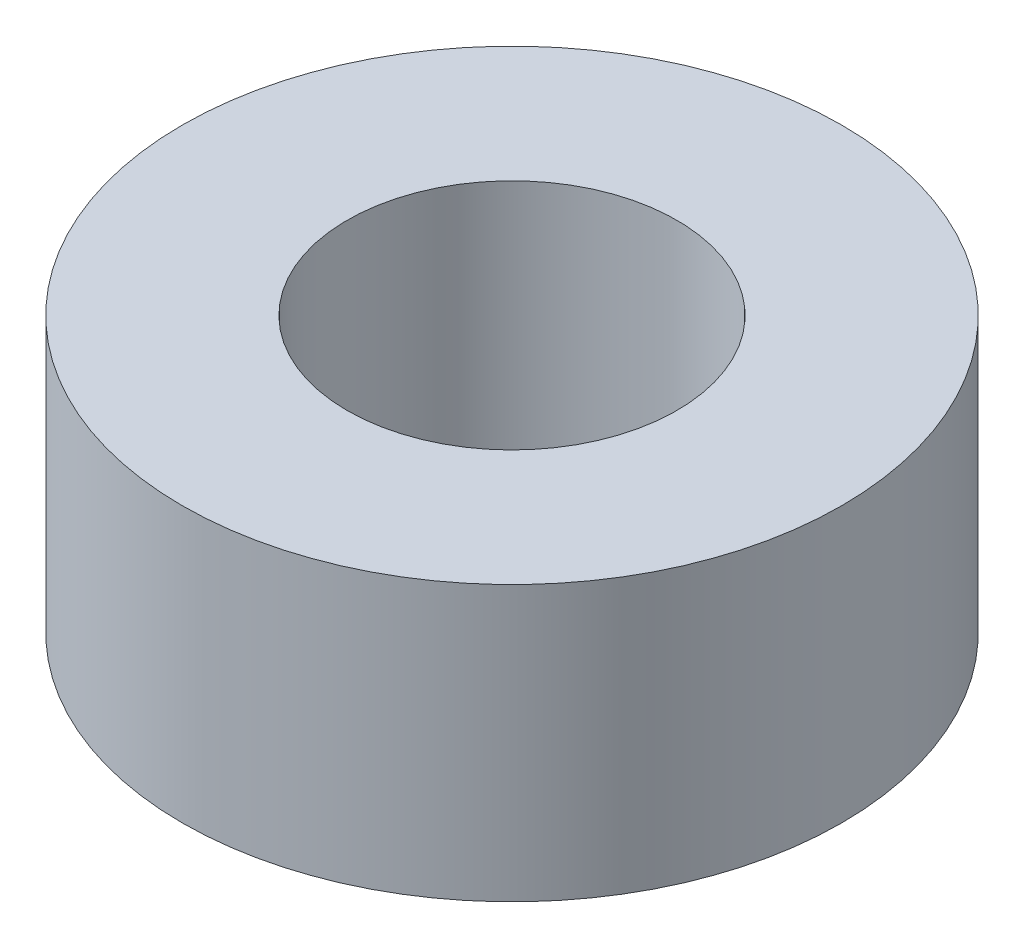
ISO-10303-21;
HEADER;
FILE_DESCRIPTION(('STEP AP214'),'2;1');
FILE_NAME('part.step','',(''),(''),'','','');
FILE_SCHEMA(('AUTOMOTIVE_DESIGN { 1 0 10303 214 1 1 1 1 }'));
ENDSEC;
DATA;
#1=APPLICATION_CONTEXT('core data for automotive mechanical design processes');
#2=APPLICATION_PROTOCOL_DEFINITION('international standard','automotive_design',2000,#1);
#3=PRODUCT_CONTEXT('',#1,'mechanical');
#4=PRODUCT('Part','Part','',(#3));
#5=PRODUCT_RELATED_PRODUCT_CATEGORY('part','',(#4));
#6=PRODUCT_DEFINITION_FORMATION('','',#4);
#7=PRODUCT_DEFINITION_CONTEXT('part definition',#1,'design');
#8=PRODUCT_DEFINITION('design','',#6,#7);
#9=PRODUCT_DEFINITION_SHAPE('','',#8);
#10=(LENGTH_UNIT() NAMED_UNIT(*) SI_UNIT(.MILLI.,.METRE.));
#11=(NAMED_UNIT(*) PLANE_ANGLE_UNIT() SI_UNIT($,.RADIAN.));
#12=(NAMED_UNIT(*) SI_UNIT($,.STERADIAN.) SOLID_ANGLE_UNIT());
#13=UNCERTAINTY_MEASURE_WITH_UNIT(LENGTH_MEASURE(1.E-05),#10,'distance_accuracy_value','');
#14=(GEOMETRIC_REPRESENTATION_CONTEXT(3) GLOBAL_UNCERTAINTY_ASSIGNED_CONTEXT((#13)) GLOBAL_UNIT_ASSIGNED_CONTEXT((#10,
#11,#12)) REPRESENTATION_CONTEXT('',''));
#15=CARTESIAN_POINT('',(0.,0.,0.));
#16=DIRECTION('',(0.,0.,1.));
#17=DIRECTION('',(1.,0.,0.));
#18=AXIS2_PLACEMENT_3D('',#15,#16,#17);
#19=CARTESIAN_POINT('',(0.,2.5,0.));
#20=DIRECTION('',(0.,1.,0.));
#21=DIRECTION('',(0.,0.,1.));
#22=AXIS2_PLACEMENT_3D('',#19,#20,#21);
#23=PLANE('',#22);
#24=CARTESIAN_POINT('',(0.,2.5,0.));
#25=DIRECTION('',(0.,1.,0.));
#26=DIRECTION('',(0.,0.,1.));
#27=AXIS2_PLACEMENT_3D('',#24,#25,#26);
#28=CIRCLE('',#27,3.);
#29=CARTESIAN_POINT('',(0.,2.5,3.));
#30=VERTEX_POINT('',#29);
#31=EDGE_CURVE('E10',#30,#30,#28,.T.);
#32=ORIENTED_EDGE('',*,*,#31,.T.);
#33=EDGE_LOOP('',(#32));
#34=FACE_BOUND('',#33,.T.);
#35=CARTESIAN_POINT('',(0.,2.5,0.));
#36=DIRECTION('',(0.,1.,0.));
#37=DIRECTION('',(0.,0.,1.));
#38=AXIS2_PLACEMENT_3D('',#35,#36,#37);
#39=CIRCLE('',#38,1.5);
#40=CARTESIAN_POINT('',(0.,2.5,1.5));
#41=VERTEX_POINT('',#40);
#42=EDGE_CURVE('E41',#41,#41,#39,.T.);
#43=ORIENTED_EDGE('',*,*,#42,.F.);
#44=EDGE_LOOP('',(#43));
#45=FACE_BOUND('',#44,.T.);
#46=ADVANCED_FACE('F30',(#34,#45),#23,.T.);
#47=CARTESIAN_POINT('',(0.,0.,0.));
#48=DIRECTION('',(0.,1.,0.));
#49=DIRECTION('',(0.,0.,1.));
#50=AXIS2_PLACEMENT_3D('',#47,#48,#49);
#51=PLANE('',#50);
#52=CARTESIAN_POINT('',(0.,0.,0.));
#53=DIRECTION('',(0.,1.,0.));
#54=DIRECTION('',(0.,0.,1.));
#55=AXIS2_PLACEMENT_3D('',#52,#53,#54);
#56=CIRCLE('',#55,3.);
#57=CARTESIAN_POINT('',(0.,0.,3.));
#58=VERTEX_POINT('',#57);
#59=EDGE_CURVE('E34',#58,#58,#56,.T.);
#60=ORIENTED_EDGE('',*,*,#59,.F.);
#61=EDGE_LOOP('',(#60));
#62=FACE_BOUND('',#61,.T.);
#63=CARTESIAN_POINT('',(0.,0.,0.));
#64=DIRECTION('',(0.,1.,0.));
#65=DIRECTION('',(0.,0.,1.));
#66=AXIS2_PLACEMENT_3D('',#63,#64,#65);
#67=CIRCLE('',#66,1.5);
#68=CARTESIAN_POINT('',(0.,0.,1.5));
#69=VERTEX_POINT('',#68);
#70=EDGE_CURVE('E43',#69,#69,#67,.T.);
#71=ORIENTED_EDGE('',*,*,#70,.T.);
#72=EDGE_LOOP('',(#71));
#73=FACE_BOUND('',#72,.T.);
#74=ADVANCED_FACE('F53',(#62,#73),#51,.F.);
#75=CARTESIAN_POINT('',(0.,2.5,0.));
#76=DIRECTION('',(0.,-1.,0.));
#77=DIRECTION('',(0.,0.,-1.));
#78=AXIS2_PLACEMENT_3D('',#75,#76,#77);
#79=CYLINDRICAL_SURFACE('',#78,3.);
#80=ORIENTED_EDGE('',*,*,#31,.F.);
#81=EDGE_LOOP('',(#80));
#82=FACE_BOUND('',#81,.T.);
#83=ORIENTED_EDGE('',*,*,#59,.T.);
#84=EDGE_LOOP('',(#83));
#85=FACE_BOUND('',#84,.T.);
#86=ADVANCED_FACE('F32',(#82,#85),#79,.T.);
#87=CARTESIAN_POINT('',(0.,2.5,0.));
#88=DIRECTION('',(0.,-1.,0.));
#89=DIRECTION('',(0.,0.,-1.));
#90=AXIS2_PLACEMENT_3D('',#87,#88,#89);
#91=CYLINDRICAL_SURFACE('',#90,1.5);
#92=ORIENTED_EDGE('',*,*,#42,.T.);
#93=EDGE_LOOP('',(#92));
#94=FACE_BOUND('',#93,.T.);
#95=ORIENTED_EDGE('',*,*,#70,.F.);
#96=EDGE_LOOP('',(#95));
#97=FACE_BOUND('',#96,.T.);
#98=ADVANCED_FACE('F49',(#94,#97),#91,.F.);
#99=CLOSED_SHELL('',(#46,#74,#86,#98));
#100=MANIFOLD_SOLID_BREP('B2',#99);
#101=ADVANCED_BREP_SHAPE_REPRESENTATION('',(#18,#100),#14);
#102=SHAPE_DEFINITION_REPRESENTATION(#9,#101);
ENDSEC;
END-ISO-10303-21;
